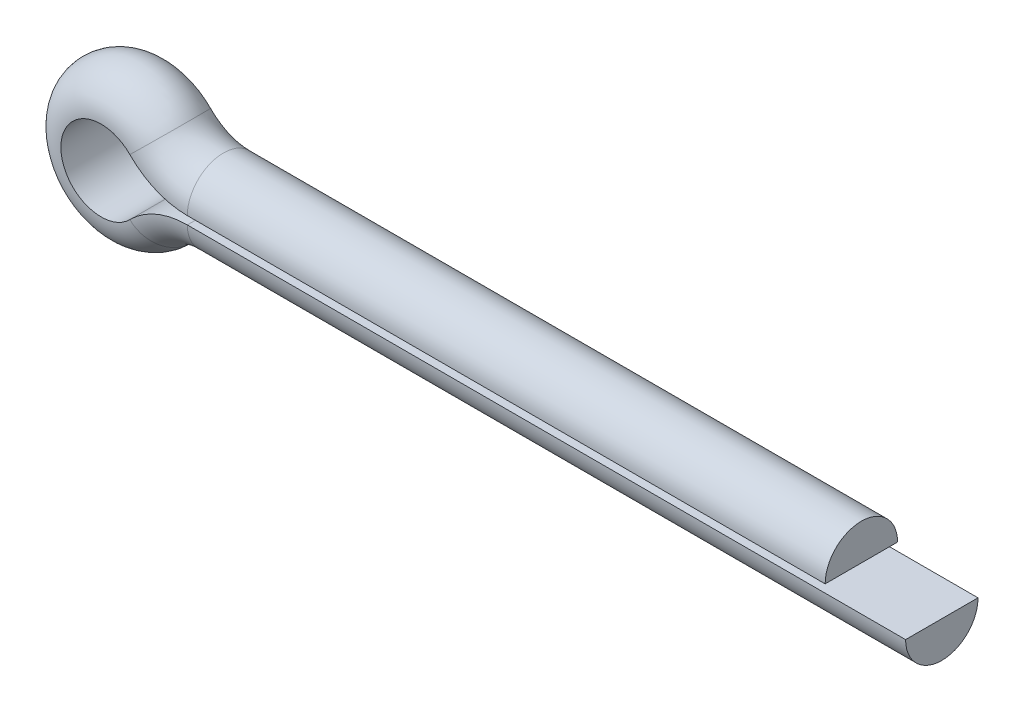
ISO-10303-21;
HEADER;
FILE_DESCRIPTION(('STEP AP214'),'2;1');
FILE_NAME('part.step','',(''),(''),'','','');
FILE_SCHEMA(('AUTOMOTIVE_DESIGN { 1 0 10303 214 1 1 1 1 }'));
ENDSEC;
DATA;
#1=APPLICATION_CONTEXT('core data for automotive mechanical design processes');
#2=APPLICATION_PROTOCOL_DEFINITION('international standard','automotive_design',2000,#1);
#3=PRODUCT_CONTEXT('',#1,'mechanical');
#4=PRODUCT('Part','Part','',(#3));
#5=PRODUCT_RELATED_PRODUCT_CATEGORY('part','',(#4));
#6=PRODUCT_DEFINITION_FORMATION('','',#4);
#7=PRODUCT_DEFINITION_CONTEXT('part definition',#1,'design');
#8=PRODUCT_DEFINITION('design','',#6,#7);
#9=PRODUCT_DEFINITION_SHAPE('','',#8);
#10=(LENGTH_UNIT() NAMED_UNIT(*) SI_UNIT(.MILLI.,.METRE.));
#11=(NAMED_UNIT(*) PLANE_ANGLE_UNIT() SI_UNIT($,.RADIAN.));
#12=(NAMED_UNIT(*) SI_UNIT($,.STERADIAN.) SOLID_ANGLE_UNIT());
#13=UNCERTAINTY_MEASURE_WITH_UNIT(LENGTH_MEASURE(1.E-05),#10,'distance_accuracy_value','');
#14=(GEOMETRIC_REPRESENTATION_CONTEXT(3) GLOBAL_UNCERTAINTY_ASSIGNED_CONTEXT((#13)) GLOBAL_UNIT_ASSIGNED_CONTEXT((#10,
#11,#12)) REPRESENTATION_CONTEXT('',''));
#15=CARTESIAN_POINT('',(0.,0.,0.));
#16=DIRECTION('',(0.,0.,1.));
#17=DIRECTION('',(1.,0.,0.));
#18=AXIS2_PLACEMENT_3D('',#15,#16,#17);
#19=CARTESIAN_POINT('',(2.14242852856287,-0.099999999999998,-0.9));
#20=DIRECTION('',(0.,1.,0.));
#21=DIRECTION('',(-1.,0.,0.));
#22=AXIS2_PLACEMENT_3D('',#19,#20,#21);
#23=PLANE('',#22);
#24=DIRECTION('',(0.,0.,1.));
#25=VECTOR('',#24,1.);
#26=CARTESIAN_POINT('',(2.14242852856287,-0.099999999999998,-0.9));
#27=LINE('',#26,#25);
#28=CARTESIAN_POINT('',(2.14242852856287,-0.099999999999998,-0.9));
#29=VERTEX_POINT('',#28);
#30=CARTESIAN_POINT('',(2.14242852856287,-0.099999999999998,0.9));
#31=VERTEX_POINT('',#30);
#32=EDGE_CURVE('E137',#29,#31,#27,.T.);
#33=ORIENTED_EDGE('',*,*,#32,.T.);
#34=DIRECTION('',(1.,0.,0.));
#35=VECTOR('',#34,1.);
#36=CARTESIAN_POINT('',(2.14242852856287,-0.099999999999998,0.9));
#37=LINE('',#36,#35);
#38=CARTESIAN_POINT('',(20.,-0.100000000000001,0.9));
#39=VERTEX_POINT('',#38);
#40=EDGE_CURVE('E37',#31,#39,#37,.T.);
#41=ORIENTED_EDGE('',*,*,#40,.T.);
#42=DIRECTION('',(0.,0.,1.));
#43=VECTOR('',#42,1.);
#44=CARTESIAN_POINT('',(20.,-0.100000000000001,-0.9));
#45=LINE('',#44,#43);
#46=CARTESIAN_POINT('',(20.,-0.100000000000001,-0.9));
#47=VERTEX_POINT('',#46);
#48=EDGE_CURVE('E44',#47,#39,#45,.T.);
#49=ORIENTED_EDGE('',*,*,#48,.F.);
#50=DIRECTION('',(1.,0.,0.));
#51=VECTOR('',#50,1.);
#52=CARTESIAN_POINT('',(2.14242852856287,-0.099999999999998,-0.9));
#53=LINE('',#52,#51);
#54=EDGE_CURVE('E11',#29,#47,#53,.T.);
#55=ORIENTED_EDGE('',*,*,#54,.F.);
#56=EDGE_LOOP('',(#33,#41,#49,#55));
#57=FACE_BOUND('',#56,.T.);
#58=ADVANCED_FACE('F30',(#57),#23,.T.);
#59=CARTESIAN_POINT('',(2.14242852856287,-0.099999999999998,0.));
#60=DIRECTION('',(1.,0.,0.));
#61=DIRECTION('',(0.,1.,0.));
#62=AXIS2_PLACEMENT_3D('',#59,#60,#61);
#63=CYLINDRICAL_SURFACE('',#62,0.9);
#64=CARTESIAN_POINT('',(2.14242852856287,-0.099999999999998,0.));
#65=DIRECTION('',(1.,0.,0.));
#66=DIRECTION('',(0.,1.,0.));
#67=AXIS2_PLACEMENT_3D('',#64,#65,#66);
#68=CIRCLE('',#67,0.9);
#69=EDGE_CURVE('E134',#31,#29,#68,.T.);
#70=ORIENTED_EDGE('',*,*,#69,.T.);
#71=ORIENTED_EDGE('',*,*,#54,.T.);
#72=CARTESIAN_POINT('',(20.,-0.100000000000001,0.));
#73=DIRECTION('',(1.,0.,0.));
#74=DIRECTION('',(0.,1.,0.));
#75=AXIS2_PLACEMENT_3D('',#72,#73,#74);
#76=CIRCLE('',#75,0.9);
#77=EDGE_CURVE('E50',#39,#47,#76,.T.);
#78=ORIENTED_EDGE('',*,*,#77,.F.);
#79=ORIENTED_EDGE('',*,*,#40,.F.);
#80=EDGE_LOOP('',(#70,#71,#78,#79));
#81=FACE_BOUND('',#80,.T.);
#82=ADVANCED_FACE('F149',(#81),#63,.T.);
#83=CARTESIAN_POINT('',(2.14242852856286,-2.1,0.));
#84=DIRECTION('',(0.,0.,-1.));
#85=DIRECTION('',(-1.,0.,0.));
#86=AXIS2_PLACEMENT_3D('',#83,#84,#85);
#87=CYLINDRICAL_SURFACE('',#86,2.);
#88=DIRECTION('',(0.,0.,1.));
#89=VECTOR('',#88,1.);
#90=CARTESIAN_POINT('',(0.714142842854294,-0.69999999999999,-0.9));
#91=LINE('',#90,#89);
#92=CARTESIAN_POINT('',(0.714142842854294,-0.69999999999999,-0.9));
#93=VERTEX_POINT('',#92);
#94=CARTESIAN_POINT('',(0.714142842854294,-0.69999999999999,0.9));
#95=VERTEX_POINT('',#94);
#96=EDGE_CURVE('E125',#93,#95,#91,.T.);
#97=ORIENTED_EDGE('',*,*,#96,.T.);
#98=CARTESIAN_POINT('',(2.14242852856286,-2.1,0.9));
#99=DIRECTION('',(0.,0.,-1.));
#100=DIRECTION('',(-1.,0.,0.));
#101=AXIS2_PLACEMENT_3D('',#98,#99,#100);
#102=CIRCLE('',#101,2.);
#103=EDGE_CURVE('E140',#95,#31,#102,.T.);
#104=ORIENTED_EDGE('',*,*,#103,.T.);
#105=ORIENTED_EDGE('',*,*,#32,.F.);
#106=CARTESIAN_POINT('',(2.14242852856286,-2.1,-0.9));
#107=DIRECTION('',(0.,0.,-1.));
#108=DIRECTION('',(-1.,0.,0.));
#109=AXIS2_PLACEMENT_3D('',#106,#107,#108);
#110=CIRCLE('',#109,2.);
#111=EDGE_CURVE('E143',#93,#29,#110,.T.);
#112=ORIENTED_EDGE('',*,*,#111,.F.);
#113=EDGE_LOOP('',(#97,#104,#105,#112));
#114=FACE_BOUND('',#113,.T.);
#115=ADVANCED_FACE('F152',(#114),#87,.T.);
#116=CARTESIAN_POINT('',(2.14242852856286,-2.1,0.));
#117=DIRECTION('',(0.,0.,-1.));
#118=DIRECTION('',(-1.,0.,0.));
#119=AXIS2_PLACEMENT_3D('',#116,#117,#118);
#120=TOROIDAL_SURFACE('',#119,2.,0.9);
#121=CARTESIAN_POINT('',(0.714142842854294,-0.69999999999999,0.));
#122=DIRECTION('',(0.699999999999989,0.714142842854296,0.));
#123=DIRECTION('',(-0.714142842854296,0.699999999999989,0.));
#124=AXIS2_PLACEMENT_3D('',#121,#122,#123);
#125=CIRCLE('',#124,0.9);
#126=EDGE_CURVE('E93',#95,#93,#125,.T.);
#127=ORIENTED_EDGE('',*,*,#126,.T.);
#128=ORIENTED_EDGE('',*,*,#111,.T.);
#129=ORIENTED_EDGE('',*,*,#69,.F.);
#130=ORIENTED_EDGE('',*,*,#103,.F.);
#131=EDGE_LOOP('',(#127,#128,#129,#130));
#132=FACE_BOUND('',#131,.T.);
#133=ADVANCED_FACE('F153',(#132),#120,.T.);
#134=CARTESIAN_POINT('',(0.,0.,0.));
#135=DIRECTION('',(0.,0.,1.));
#136=DIRECTION('',(1.,0.,0.));
#137=AXIS2_PLACEMENT_3D('',#134,#135,#136);
#138=CYLINDRICAL_SURFACE('',#137,1.);
#139=DIRECTION('',(0.,0.,1.));
#140=VECTOR('',#139,1.);
#141=CARTESIAN_POINT('',(0.714142842854287,0.699999999999998,-0.9));
#142=LINE('',#141,#140);
#143=CARTESIAN_POINT('',(0.714142842854287,0.699999999999998,-0.9));
#144=VERTEX_POINT('',#143);
#145=CARTESIAN_POINT('',(0.714142842854287,0.699999999999998,0.9));
#146=VERTEX_POINT('',#145);
#147=EDGE_CURVE('E90',#144,#146,#142,.T.);
#148=ORIENTED_EDGE('',*,*,#147,.T.);
#149=CARTESIAN_POINT('',(0.,0.,0.9));
#150=DIRECTION('',(0.,0.,1.));
#151=DIRECTION('',(1.,0.,0.));
#152=AXIS2_PLACEMENT_3D('',#149,#150,#151);
#153=CIRCLE('',#152,1.);
#154=EDGE_CURVE('E128',#146,#95,#153,.T.);
#155=ORIENTED_EDGE('',*,*,#154,.T.);
#156=ORIENTED_EDGE('',*,*,#96,.F.);
#157=CARTESIAN_POINT('',(0.,0.,-0.9));
#158=DIRECTION('',(0.,0.,1.));
#159=DIRECTION('',(1.,0.,0.));
#160=AXIS2_PLACEMENT_3D('',#157,#158,#159);
#161=CIRCLE('',#160,1.);
#162=EDGE_CURVE('E131',#144,#93,#161,.T.);
#163=ORIENTED_EDGE('',*,*,#162,.F.);
#164=EDGE_LOOP('',(#148,#155,#156,#163));
#165=FACE_BOUND('',#164,.T.);
#166=ADVANCED_FACE('F158',(#165),#138,.F.);
#167=CARTESIAN_POINT('',(0.,0.,0.));
#168=DIRECTION('',(0.,0.,1.));
#169=DIRECTION('',(1.,0.,0.));
#170=AXIS2_PLACEMENT_3D('',#167,#168,#169);
#171=TOROIDAL_SURFACE('',#170,1.,0.9);
#172=CARTESIAN_POINT('',(0.714142842854287,0.699999999999998,0.));
#173=DIRECTION('',(-0.699999999999999,0.714142842854286,0.));
#174=DIRECTION('',(-0.714142842854286,-0.699999999999999,0.));
#175=AXIS2_PLACEMENT_3D('',#172,#173,#174);
#176=CIRCLE('',#175,0.9);
#177=EDGE_CURVE('E114',#146,#144,#176,.T.);
#178=ORIENTED_EDGE('',*,*,#177,.T.);
#179=ORIENTED_EDGE('',*,*,#162,.T.);
#180=ORIENTED_EDGE('',*,*,#126,.F.);
#181=ORIENTED_EDGE('',*,*,#154,.F.);
#182=EDGE_LOOP('',(#178,#179,#180,#181));
#183=FACE_BOUND('',#182,.T.);
#184=ADVANCED_FACE('F159',(#183),#171,.T.);
#185=CARTESIAN_POINT('',(2.14242852856286,2.1,0.));
#186=DIRECTION('',(0.,0.,-1.));
#187=DIRECTION('',(-1.,0.,0.));
#188=AXIS2_PLACEMENT_3D('',#185,#186,#187);
#189=CYLINDRICAL_SURFACE('',#188,2.);
#190=DIRECTION('',(0.,0.,1.));
#191=VECTOR('',#190,1.);
#192=CARTESIAN_POINT('',(2.14242852856286,0.0999999999999981,-0.9));
#193=LINE('',#192,#191);
#194=CARTESIAN_POINT('',(2.14242852856286,0.0999999999999981,-0.9));
#195=VERTEX_POINT('',#194);
#196=CARTESIAN_POINT('',(2.14242852856286,0.0999999999999981,0.9));
#197=VERTEX_POINT('',#196);
#198=EDGE_CURVE('E87',#195,#197,#193,.T.);
#199=ORIENTED_EDGE('',*,*,#198,.T.);
#200=CARTESIAN_POINT('',(2.14242852856286,2.1,0.9));
#201=DIRECTION('',(0.,0.,-1.));
#202=DIRECTION('',(-1.,0.,0.));
#203=AXIS2_PLACEMENT_3D('',#200,#201,#202);
#204=CIRCLE('',#203,2.);
#205=EDGE_CURVE('E94',#197,#146,#204,.T.);
#206=ORIENTED_EDGE('',*,*,#205,.T.);
#207=ORIENTED_EDGE('',*,*,#147,.F.);
#208=CARTESIAN_POINT('',(2.14242852856286,2.1,-0.9));
#209=DIRECTION('',(0.,0.,-1.));
#210=DIRECTION('',(-1.,0.,0.));
#211=AXIS2_PLACEMENT_3D('',#208,#209,#210);
#212=CIRCLE('',#211,2.);
#213=EDGE_CURVE('E82',#195,#144,#212,.T.);
#214=ORIENTED_EDGE('',*,*,#213,.F.);
#215=EDGE_LOOP('',(#199,#206,#207,#214));
#216=FACE_BOUND('',#215,.T.);
#217=ADVANCED_FACE('F84',(#216),#189,.T.);
#218=CARTESIAN_POINT('',(2.14242852856286,2.1,0.));
#219=DIRECTION('',(0.,0.,-1.));
#220=DIRECTION('',(-1.,0.,0.));
#221=AXIS2_PLACEMENT_3D('',#218,#219,#220);
#222=TOROIDAL_SURFACE('',#221,2.,0.9);
#223=CARTESIAN_POINT('',(2.14242852856286,0.0999999999999981,0.));
#224=DIRECTION('',(-1.,0.,0.));
#225=DIRECTION('',(0.,-1.,0.));
#226=AXIS2_PLACEMENT_3D('',#223,#224,#225);
#227=CIRCLE('',#226,0.9);
#228=EDGE_CURVE('E97',#197,#195,#227,.T.);
#229=ORIENTED_EDGE('',*,*,#228,.T.);
#230=ORIENTED_EDGE('',*,*,#213,.T.);
#231=ORIENTED_EDGE('',*,*,#177,.F.);
#232=ORIENTED_EDGE('',*,*,#205,.F.);
#233=EDGE_LOOP('',(#229,#230,#231,#232));
#234=FACE_BOUND('',#233,.T.);
#235=ADVANCED_FACE('F98',(#234),#222,.T.);
#236=CARTESIAN_POINT('',(2.14242852856286,0.0999999999999981,0.));
#237=DIRECTION('',(1.,0.,0.));
#238=DIRECTION('',(0.,1.,0.));
#239=AXIS2_PLACEMENT_3D('',#236,#237,#238);
#240=CYLINDRICAL_SURFACE('',#239,0.9);
#241=CARTESIAN_POINT('',(18.,0.100000000000001,0.));
#242=DIRECTION('',(-1.,0.,0.));
#243=DIRECTION('',(0.,-1.,0.));
#244=AXIS2_PLACEMENT_3D('',#241,#242,#243);
#245=CIRCLE('',#244,0.9);
#246=CARTESIAN_POINT('',(18.,0.100000000000001,0.9));
#247=VERTEX_POINT('',#246);
#248=CARTESIAN_POINT('',(18.,0.100000000000001,-0.9));
#249=VERTEX_POINT('',#248);
#250=EDGE_CURVE('E113',#247,#249,#245,.T.);
#251=ORIENTED_EDGE('',*,*,#250,.T.);
#252=DIRECTION('',(1.,0.,0.));
#253=VECTOR('',#252,1.);
#254=CARTESIAN_POINT('',(2.14242852856286,0.0999999999999981,-0.9));
#255=LINE('',#254,#253);
#256=EDGE_CURVE('E107',#195,#249,#255,.T.);
#257=ORIENTED_EDGE('',*,*,#256,.F.);
#258=ORIENTED_EDGE('',*,*,#228,.F.);
#259=DIRECTION('',(1.,0.,0.));
#260=VECTOR('',#259,1.);
#261=CARTESIAN_POINT('',(2.14242852856286,0.0999999999999981,0.9));
#262=LINE('',#261,#260);
#263=EDGE_CURVE('E109',#197,#247,#262,.T.);
#264=ORIENTED_EDGE('',*,*,#263,.T.);
#265=EDGE_LOOP('',(#251,#257,#258,#264));
#266=FACE_BOUND('',#265,.T.);
#267=ADVANCED_FACE('F111',(#266),#240,.T.);
#268=CARTESIAN_POINT('',(2.14242852856286,0.0999999999999981,-0.9));
#269=DIRECTION('',(0.,1.,0.));
#270=DIRECTION('',(-1.,0.,0.));
#271=AXIS2_PLACEMENT_3D('',#268,#269,#270);
#272=PLANE('',#271);
#273=DIRECTION('',(0.,0.,1.));
#274=VECTOR('',#273,1.);
#275=CARTESIAN_POINT('',(18.,0.100000000000001,-0.9));
#276=LINE('',#275,#274);
#277=EDGE_CURVE('E102',#249,#247,#276,.T.);
#278=ORIENTED_EDGE('',*,*,#277,.T.);
#279=ORIENTED_EDGE('',*,*,#263,.F.);
#280=ORIENTED_EDGE('',*,*,#198,.F.);
#281=ORIENTED_EDGE('',*,*,#256,.T.);
#282=EDGE_LOOP('',(#278,#279,#280,#281));
#283=FACE_BOUND('',#282,.T.);
#284=ADVANCED_FACE('F106',(#283),#272,.F.);
#285=CARTESIAN_POINT('',(20.,-0.100000000000001,0.));
#286=DIRECTION('',(1.,0.,0.));
#287=DIRECTION('',(0.,1.,0.));
#288=AXIS2_PLACEMENT_3D('',#285,#286,#287);
#289=PLANE('',#288);
#290=ORIENTED_EDGE('',*,*,#77,.T.);
#291=ORIENTED_EDGE('',*,*,#48,.T.);
#292=EDGE_LOOP('',(#290,#291));
#293=FACE_BOUND('',#292,.T.);
#294=ADVANCED_FACE('F221',(#293),#289,.T.);
#295=CARTESIAN_POINT('',(18.,0.100000000000001,0.));
#296=DIRECTION('',(-1.,0.,0.));
#297=DIRECTION('',(0.,-1.,0.));
#298=AXIS2_PLACEMENT_3D('',#295,#296,#297);
#299=PLANE('',#298);
#300=ORIENTED_EDGE('',*,*,#250,.F.);
#301=ORIENTED_EDGE('',*,*,#277,.F.);
#302=EDGE_LOOP('',(#300,#301));
#303=FACE_BOUND('',#302,.T.);
#304=ADVANCED_FACE('F230',(#303),#299,.F.);
#305=CLOSED_SHELL('',(#58,#82,#115,#133,#166,#184,#217,#235,#267,#284,#294,#304));
#306=MANIFOLD_SOLID_BREP('B2',#305);
#307=ADVANCED_BREP_SHAPE_REPRESENTATION('',(#18,#306),#14);
#308=SHAPE_DEFINITION_REPRESENTATION(#9,#307);
ENDSEC;
END-ISO-10303-21;
